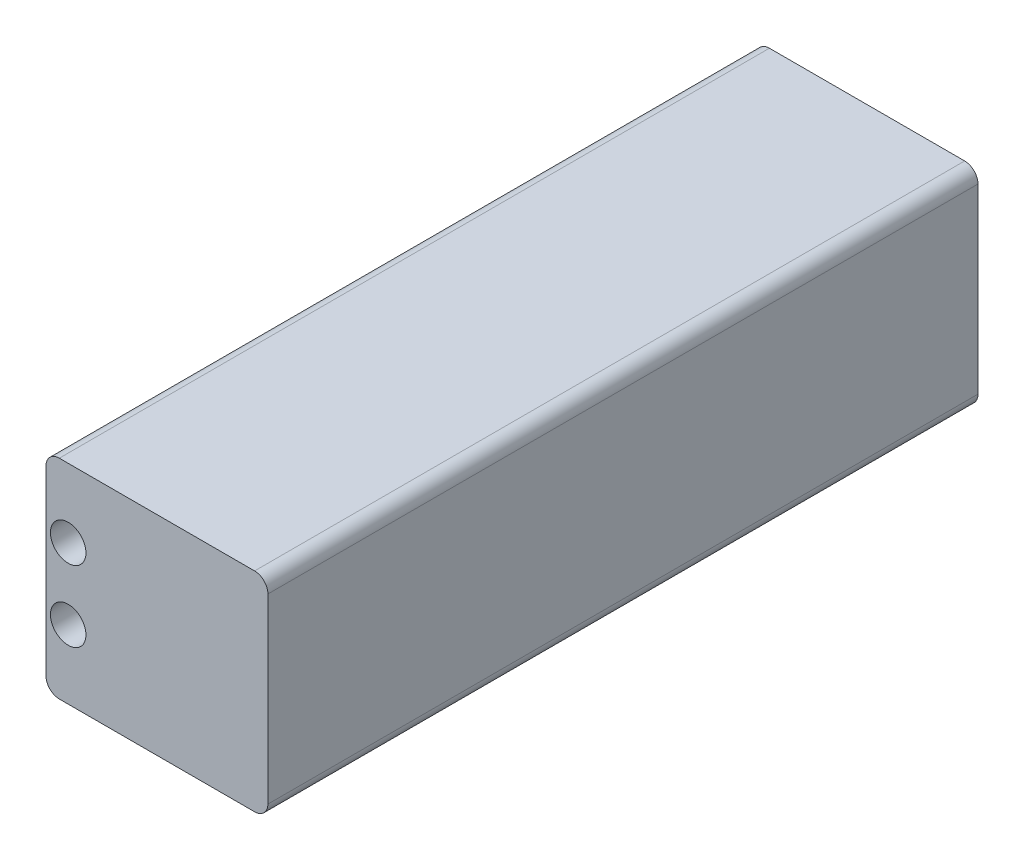
ISO-10303-21;
HEADER;
FILE_DESCRIPTION(('STEP AP214'),'2;1');
FILE_NAME('part.step','',(''),(''),'','','');
FILE_SCHEMA(('AUTOMOTIVE_DESIGN { 1 0 10303 214 1 1 1 1 }'));
ENDSEC;
DATA;
#1=APPLICATION_CONTEXT('core data for automotive mechanical design processes');
#2=APPLICATION_PROTOCOL_DEFINITION('international standard','automotive_design',2000,#1);
#3=PRODUCT_CONTEXT('',#1,'mechanical');
#4=PRODUCT('Part','Part','',(#3));
#5=PRODUCT_RELATED_PRODUCT_CATEGORY('part','',(#4));
#6=PRODUCT_DEFINITION_FORMATION('','',#4);
#7=PRODUCT_DEFINITION_CONTEXT('part definition',#1,'design');
#8=PRODUCT_DEFINITION('design','',#6,#7);
#9=PRODUCT_DEFINITION_SHAPE('','',#8);
#10=(LENGTH_UNIT() NAMED_UNIT(*) SI_UNIT(.MILLI.,.METRE.));
#11=(NAMED_UNIT(*) PLANE_ANGLE_UNIT() SI_UNIT($,.RADIAN.));
#12=(NAMED_UNIT(*) SI_UNIT($,.STERADIAN.) SOLID_ANGLE_UNIT());
#13=UNCERTAINTY_MEASURE_WITH_UNIT(LENGTH_MEASURE(1.E-05),#10,'distance_accuracy_value','');
#14=(GEOMETRIC_REPRESENTATION_CONTEXT(3) GLOBAL_UNCERTAINTY_ASSIGNED_CONTEXT((#13)) GLOBAL_UNIT_ASSIGNED_CONTEXT((#10,
#11,#12)) REPRESENTATION_CONTEXT('',''));
#15=CARTESIAN_POINT('',(0.,0.,0.));
#16=DIRECTION('',(0.,0.,1.));
#17=DIRECTION('',(1.,0.,0.));
#18=AXIS2_PLACEMENT_3D('',#15,#16,#17);
#19=CARTESIAN_POINT('',(25.,47.,80.));
#20=DIRECTION('',(-1.,0.,0.));
#21=DIRECTION('',(0.,0.,1.));
#22=AXIS2_PLACEMENT_3D('',#19,#20,#21);
#23=PLANE('',#22);
#24=DIRECTION('',(0.,-1.,0.));
#25=VECTOR('',#24,1.);
#26=CARTESIAN_POINT('',(25.,47.,80.));
#27=LINE('',#26,#25);
#28=CARTESIAN_POINT('',(25.,44.,80.));
#29=VERTEX_POINT('',#28);
#30=CARTESIAN_POINT('',(25.,3.,80.));
#31=VERTEX_POINT('',#30);
#32=EDGE_CURVE('E127',#29,#31,#27,.T.);
#33=ORIENTED_EDGE('',*,*,#32,.T.);
#34=DIRECTION('',(0.,0.,-1.));
#35=VECTOR('',#34,1.);
#36=CARTESIAN_POINT('',(25.,3.,-80.));
#37=LINE('',#36,#35);
#38=CARTESIAN_POINT('',(25.,3.,-80.));
#39=VERTEX_POINT('',#38);
#40=EDGE_CURVE('E153',#31,#39,#37,.T.);
#41=ORIENTED_EDGE('',*,*,#40,.T.);
#42=DIRECTION('',(0.,-1.,0.));
#43=VECTOR('',#42,1.);
#44=CARTESIAN_POINT('',(25.,47.,-80.));
#45=LINE('',#44,#43);
#46=CARTESIAN_POINT('',(25.,44.,-80.));
#47=VERTEX_POINT('',#46);
#48=EDGE_CURVE('E132',#47,#39,#45,.T.);
#49=ORIENTED_EDGE('',*,*,#48,.F.);
#50=DIRECTION('',(0.,0.,-1.));
#51=VECTOR('',#50,1.);
#52=CARTESIAN_POINT('',(25.,44.,80.));
#53=LINE('',#52,#51);
#54=EDGE_CURVE('E151',#47,#29,#53,.F.);
#55=ORIENTED_EDGE('',*,*,#54,.T.);
#56=EDGE_LOOP('',(#33,#41,#49,#55));
#57=FACE_BOUND('',#56,.T.);
#58=ADVANCED_FACE('F39',(#57),#23,.F.);
#59=CARTESIAN_POINT('',(-25.,47.,-80.));
#60=DIRECTION('',(0.,0.,1.));
#61=DIRECTION('',(1.,0.,0.));
#62=AXIS2_PLACEMENT_3D('',#59,#60,#61);
#63=PLANE('',#62);
#64=DIRECTION('',(-1.,0.,0.));
#65=VECTOR('',#64,1.);
#66=CARTESIAN_POINT('',(-25.,0.,-80.));
#67=LINE('',#66,#65);
#68=CARTESIAN_POINT('',(22.,0.,-80.));
#69=VERTEX_POINT('',#68);
#70=CARTESIAN_POINT('',(-22.,0.,-80.));
#71=VERTEX_POINT('',#70);
#72=EDGE_CURVE('E168',#69,#71,#67,.T.);
#73=ORIENTED_EDGE('',*,*,#72,.T.);
#74=CARTESIAN_POINT('',(-22.,3.,-80.));
#75=DIRECTION('',(0.,0.,1.));
#76=DIRECTION('',(1.,0.,0.));
#77=AXIS2_PLACEMENT_3D('',#74,#75,#76);
#78=CIRCLE('',#77,3.);
#79=CARTESIAN_POINT('',(-25.,3.,-80.));
#80=VERTEX_POINT('',#79);
#81=EDGE_CURVE('E149',#71,#80,#78,.F.);
#82=ORIENTED_EDGE('',*,*,#81,.T.);
#83=DIRECTION('',(0.,-1.,0.));
#84=VECTOR('',#83,1.);
#85=CARTESIAN_POINT('',(-25.,47.,-80.));
#86=LINE('',#85,#84);
#87=CARTESIAN_POINT('',(-25.,44.,-80.));
#88=VERTEX_POINT('',#87);
#89=EDGE_CURVE('E126',#88,#80,#86,.T.);
#90=ORIENTED_EDGE('',*,*,#89,.F.);
#91=CARTESIAN_POINT('',(-22.,44.,-80.));
#92=DIRECTION('',(0.,0.,1.));
#93=DIRECTION('',(1.,0.,0.));
#94=AXIS2_PLACEMENT_3D('',#91,#92,#93);
#95=CIRCLE('',#94,3.);
#96=CARTESIAN_POINT('',(-22.,47.,-80.));
#97=VERTEX_POINT('',#96);
#98=EDGE_CURVE('E131',#88,#97,#95,.F.);
#99=ORIENTED_EDGE('',*,*,#98,.T.);
#100=DIRECTION('',(-1.,0.,0.));
#101=VECTOR('',#100,1.);
#102=CARTESIAN_POINT('',(-25.,47.,-80.));
#103=LINE('',#102,#101);
#104=CARTESIAN_POINT('',(22.,47.,-80.));
#105=VERTEX_POINT('',#104);
#106=EDGE_CURVE('E159',#105,#97,#103,.T.);
#107=ORIENTED_EDGE('',*,*,#106,.F.);
#108=CARTESIAN_POINT('',(22.,44.,-80.));
#109=DIRECTION('',(0.,0.,1.));
#110=DIRECTION('',(1.,0.,0.));
#111=AXIS2_PLACEMENT_3D('',#108,#109,#110);
#112=CIRCLE('',#111,3.);
#113=EDGE_CURVE('E62',#105,#47,#112,.F.);
#114=ORIENTED_EDGE('',*,*,#113,.T.);
#115=ORIENTED_EDGE('',*,*,#48,.T.);
#116=CARTESIAN_POINT('',(22.,3.,-80.));
#117=DIRECTION('',(0.,0.,1.));
#118=DIRECTION('',(1.,0.,0.));
#119=AXIS2_PLACEMENT_3D('',#116,#117,#118);
#120=CIRCLE('',#119,3.);
#121=EDGE_CURVE('E54',#39,#69,#120,.F.);
#122=ORIENTED_EDGE('',*,*,#121,.T.);
#123=EDGE_LOOP('',(#73,#82,#90,#99,#107,#114,#115,#122));
#124=FACE_BOUND('',#123,.T.);
#125=ADVANCED_FACE('F163',(#124),#63,.F.);
#126=CARTESIAN_POINT('',(-25.,47.,80.));
#127=DIRECTION('',(1.,0.,0.));
#128=DIRECTION('',(0.,0.,-1.));
#129=AXIS2_PLACEMENT_3D('',#126,#127,#128);
#130=PLANE('',#129);
#131=ORIENTED_EDGE('',*,*,#89,.T.);
#132=DIRECTION('',(0.,0.,1.));
#133=VECTOR('',#132,1.);
#134=CARTESIAN_POINT('',(-25.,3.,80.));
#135=LINE('',#134,#133);
#136=CARTESIAN_POINT('',(-25.,3.,80.));
#137=VERTEX_POINT('',#136);
#138=EDGE_CURVE('E125',#80,#137,#135,.T.);
#139=ORIENTED_EDGE('',*,*,#138,.T.);
#140=DIRECTION('',(0.,-1.,0.));
#141=VECTOR('',#140,1.);
#142=CARTESIAN_POINT('',(-25.,47.,80.));
#143=LINE('',#142,#141);
#144=CARTESIAN_POINT('',(-25.,44.,80.));
#145=VERTEX_POINT('',#144);
#146=EDGE_CURVE('E109',#145,#137,#143,.T.);
#147=ORIENTED_EDGE('',*,*,#146,.F.);
#148=DIRECTION('',(0.,0.,1.));
#149=VECTOR('',#148,1.);
#150=CARTESIAN_POINT('',(-25.,44.,80.));
#151=LINE('',#150,#149);
#152=EDGE_CURVE('E122',#145,#88,#151,.F.);
#153=ORIENTED_EDGE('',*,*,#152,.T.);
#154=EDGE_LOOP('',(#131,#139,#147,#153));
#155=FACE_BOUND('',#154,.T.);
#156=ADVANCED_FACE('F121',(#155),#130,.F.);
#157=CARTESIAN_POINT('',(-25.,47.,80.));
#158=DIRECTION('',(0.,0.,-1.));
#159=DIRECTION('',(-1.,0.,0.));
#160=AXIS2_PLACEMENT_3D('',#157,#158,#159);
#161=PLANE('',#160);
#162=CARTESIAN_POINT('',(-20.,31.5,80.));
#163=DIRECTION('',(0.,0.,1.));
#164=DIRECTION('',(1.,0.,0.));
#165=AXIS2_PLACEMENT_3D('',#162,#163,#164);
#166=CIRCLE('',#165,4.);
#167=CARTESIAN_POINT('',(-16.,31.5,80.));
#168=VERTEX_POINT('',#167);
#169=EDGE_CURVE('E308',#168,#168,#166,.T.);
#170=ORIENTED_EDGE('',*,*,#169,.F.);
#171=EDGE_LOOP('',(#170));
#172=FACE_BOUND('',#171,.T.);
#173=CARTESIAN_POINT('',(-20.,15.5,80.));
#174=DIRECTION('',(0.,0.,1.));
#175=DIRECTION('',(-1.,0.,0.));
#176=AXIS2_PLACEMENT_3D('',#173,#174,#175);
#177=CIRCLE('',#176,4.);
#178=CARTESIAN_POINT('',(-24.,15.5,80.));
#179=VERTEX_POINT('',#178);
#180=EDGE_CURVE('E311',#179,#179,#177,.T.);
#181=ORIENTED_EDGE('',*,*,#180,.F.);
#182=EDGE_LOOP('',(#181));
#183=FACE_BOUND('',#182,.T.);
#184=ORIENTED_EDGE('',*,*,#146,.T.);
#185=CARTESIAN_POINT('',(-22.,3.,80.));
#186=DIRECTION('',(0.,0.,-1.));
#187=DIRECTION('',(-1.,0.,0.));
#188=AXIS2_PLACEMENT_3D('',#185,#186,#187);
#189=CIRCLE('',#188,3.);
#190=CARTESIAN_POINT('',(-22.,0.,80.));
#191=VERTEX_POINT('',#190);
#192=EDGE_CURVE('E140',#137,#191,#189,.F.);
#193=ORIENTED_EDGE('',*,*,#192,.T.);
#194=DIRECTION('',(1.,0.,0.));
#195=VECTOR('',#194,1.);
#196=CARTESIAN_POINT('',(-25.,0.,80.));
#197=LINE('',#196,#195);
#198=CARTESIAN_POINT('',(22.,0.,80.));
#199=VERTEX_POINT('',#198);
#200=EDGE_CURVE('E164',#191,#199,#197,.T.);
#201=ORIENTED_EDGE('',*,*,#200,.T.);
#202=CARTESIAN_POINT('',(22.,3.,80.));
#203=DIRECTION('',(0.,0.,-1.));
#204=DIRECTION('',(-1.,0.,0.));
#205=AXIS2_PLACEMENT_3D('',#202,#203,#204);
#206=CIRCLE('',#205,3.);
#207=EDGE_CURVE('E115',#199,#31,#206,.F.);
#208=ORIENTED_EDGE('',*,*,#207,.T.);
#209=ORIENTED_EDGE('',*,*,#32,.F.);
#210=CARTESIAN_POINT('',(22.,44.,80.));
#211=DIRECTION('',(0.,0.,-1.));
#212=DIRECTION('',(-1.,0.,0.));
#213=AXIS2_PLACEMENT_3D('',#210,#211,#212);
#214=CIRCLE('',#213,3.);
#215=CARTESIAN_POINT('',(22.,47.,80.));
#216=VERTEX_POINT('',#215);
#217=EDGE_CURVE('E116',#29,#216,#214,.F.);
#218=ORIENTED_EDGE('',*,*,#217,.T.);
#219=DIRECTION('',(1.,0.,0.));
#220=VECTOR('',#219,1.);
#221=CARTESIAN_POINT('',(-25.,47.,80.));
#222=LINE('',#221,#220);
#223=CARTESIAN_POINT('',(-22.,47.,80.));
#224=VERTEX_POINT('',#223);
#225=EDGE_CURVE('E111',#224,#216,#222,.T.);
#226=ORIENTED_EDGE('',*,*,#225,.F.);
#227=CARTESIAN_POINT('',(-22.,44.,80.));
#228=DIRECTION('',(0.,0.,-1.));
#229=DIRECTION('',(-1.,0.,0.));
#230=AXIS2_PLACEMENT_3D('',#227,#228,#229);
#231=CIRCLE('',#230,3.);
#232=EDGE_CURVE('E106',#224,#145,#231,.F.);
#233=ORIENTED_EDGE('',*,*,#232,.T.);
#234=EDGE_LOOP('',(#184,#193,#201,#208,#209,#218,#226,#233));
#235=FACE_BOUND('',#234,.T.);
#236=ADVANCED_FACE('F108',(#172,#183,#235),#161,.F.);
#237=CARTESIAN_POINT('',(0.,47.,0.));
#238=DIRECTION('',(0.,-1.,0.));
#239=DIRECTION('',(0.,0.,-1.));
#240=AXIS2_PLACEMENT_3D('',#237,#238,#239);
#241=PLANE('',#240);
#242=ORIENTED_EDGE('',*,*,#106,.T.);
#243=DIRECTION('',(0.,0.,1.));
#244=VECTOR('',#243,1.);
#245=CARTESIAN_POINT('',(-22.,47.,0.));
#246=LINE('',#245,#244);
#247=EDGE_CURVE('E11',#97,#224,#246,.T.);
#248=ORIENTED_EDGE('',*,*,#247,.T.);
#249=ORIENTED_EDGE('',*,*,#225,.T.);
#250=DIRECTION('',(0.,0.,-1.));
#251=VECTOR('',#250,1.);
#252=CARTESIAN_POINT('',(22.,47.,0.));
#253=LINE('',#252,#251);
#254=EDGE_CURVE('E47',#216,#105,#253,.T.);
#255=ORIENTED_EDGE('',*,*,#254,.T.);
#256=EDGE_LOOP('',(#242,#248,#249,#255));
#257=FACE_BOUND('',#256,.T.);
#258=ADVANCED_FACE('F158',(#257),#241,.F.);
#259=CARTESIAN_POINT('',(0.,0.,0.));
#260=DIRECTION('',(0.,-1.,0.));
#261=DIRECTION('',(0.,0.,-1.));
#262=AXIS2_PLACEMENT_3D('',#259,#260,#261);
#263=PLANE('',#262);
#264=ORIENTED_EDGE('',*,*,#200,.F.);
#265=DIRECTION('',(0.,0.,1.));
#266=VECTOR('',#265,1.);
#267=CARTESIAN_POINT('',(-22.,0.,-80.));
#268=LINE('',#267,#266);
#269=EDGE_CURVE('E144',#191,#71,#268,.F.);
#270=ORIENTED_EDGE('',*,*,#269,.T.);
#271=ORIENTED_EDGE('',*,*,#72,.F.);
#272=DIRECTION('',(0.,0.,-1.));
#273=VECTOR('',#272,1.);
#274=CARTESIAN_POINT('',(22.,0.,80.));
#275=LINE('',#274,#273);
#276=EDGE_CURVE('E142',#69,#199,#275,.F.);
#277=ORIENTED_EDGE('',*,*,#276,.T.);
#278=EDGE_LOOP('',(#264,#270,#271,#277));
#279=FACE_BOUND('',#278,.T.);
#280=ADVANCED_FACE('F184',(#279),#263,.T.);
#281=CARTESIAN_POINT('',(-20.,15.5,70.));
#282=DIRECTION('',(0.,0.,1.));
#283=DIRECTION('',(1.,0.,0.));
#284=AXIS2_PLACEMENT_3D('',#281,#282,#283);
#285=CYLINDRICAL_SURFACE('',#284,4.);
#286=CARTESIAN_POINT('',(-20.,15.5,70.));
#287=DIRECTION('',(0.,0.,1.));
#288=DIRECTION('',(-1.,0.,0.));
#289=AXIS2_PLACEMENT_3D('',#286,#287,#288);
#290=CIRCLE('',#289,4.);
#291=CARTESIAN_POINT('',(-24.,15.5,70.));
#292=VERTEX_POINT('',#291);
#293=EDGE_CURVE('E171',#292,#292,#290,.T.);
#294=ORIENTED_EDGE('',*,*,#293,.F.);
#295=EDGE_LOOP('',(#294));
#296=FACE_BOUND('',#295,.T.);
#297=ORIENTED_EDGE('',*,*,#180,.T.);
#298=EDGE_LOOP('',(#297));
#299=FACE_BOUND('',#298,.T.);
#300=ADVANCED_FACE('F252',(#296,#299),#285,.F.);
#301=CARTESIAN_POINT('',(-20.,15.5,70.));
#302=DIRECTION('',(0.,0.,-1.));
#303=DIRECTION('',(-1.,0.,0.));
#304=AXIS2_PLACEMENT_3D('',#301,#302,#303);
#305=PLANE('',#304);
#306=ORIENTED_EDGE('',*,*,#293,.T.);
#307=EDGE_LOOP('',(#306));
#308=FACE_BOUND('',#307,.T.);
#309=ADVANCED_FACE('F243',(#308),#305,.F.);
#310=CARTESIAN_POINT('',(-20.,31.5,70.));
#311=DIRECTION('',(0.,0.,1.));
#312=DIRECTION('',(1.,0.,0.));
#313=AXIS2_PLACEMENT_3D('',#310,#311,#312);
#314=CYLINDRICAL_SURFACE('',#313,4.);
#315=CARTESIAN_POINT('',(-20.,31.5,70.));
#316=DIRECTION('',(0.,0.,1.));
#317=DIRECTION('',(1.,0.,0.));
#318=AXIS2_PLACEMENT_3D('',#315,#316,#317);
#319=CIRCLE('',#318,4.);
#320=CARTESIAN_POINT('',(-16.,31.5,70.));
#321=VERTEX_POINT('',#320);
#322=EDGE_CURVE('E174',#321,#321,#319,.T.);
#323=ORIENTED_EDGE('',*,*,#322,.F.);
#324=EDGE_LOOP('',(#323));
#325=FACE_BOUND('',#324,.T.);
#326=ORIENTED_EDGE('',*,*,#169,.T.);
#327=EDGE_LOOP('',(#326));
#328=FACE_BOUND('',#327,.T.);
#329=ADVANCED_FACE('F234',(#325,#328),#314,.F.);
#330=CARTESIAN_POINT('',(-20.,31.5,70.));
#331=DIRECTION('',(0.,0.,1.));
#332=DIRECTION('',(1.,0.,0.));
#333=AXIS2_PLACEMENT_3D('',#330,#331,#332);
#334=PLANE('',#333);
#335=ORIENTED_EDGE('',*,*,#322,.T.);
#336=EDGE_LOOP('',(#335));
#337=FACE_BOUND('',#336,.T.);
#338=ADVANCED_FACE('F205',(#337),#334,.T.);
#339=CARTESIAN_POINT('',(-22.,3.,80.));
#340=DIRECTION('',(0.,0.,-1.));
#341=DIRECTION('',(-1.,0.,0.));
#342=AXIS2_PLACEMENT_3D('',#339,#340,#341);
#343=CYLINDRICAL_SURFACE('',#342,3.);
#344=ORIENTED_EDGE('',*,*,#81,.F.);
#345=ORIENTED_EDGE('',*,*,#269,.F.);
#346=ORIENTED_EDGE('',*,*,#192,.F.);
#347=ORIENTED_EDGE('',*,*,#138,.F.);
#348=EDGE_LOOP('',(#344,#345,#346,#347));
#349=FACE_BOUND('',#348,.T.);
#350=ADVANCED_FACE('F179',(#349),#343,.T.);
#351=CARTESIAN_POINT('',(22.,3.,80.));
#352=DIRECTION('',(0.,0.,1.));
#353=DIRECTION('',(1.,0.,0.));
#354=AXIS2_PLACEMENT_3D('',#351,#352,#353);
#355=CYLINDRICAL_SURFACE('',#354,3.);
#356=ORIENTED_EDGE('',*,*,#207,.F.);
#357=ORIENTED_EDGE('',*,*,#276,.F.);
#358=ORIENTED_EDGE('',*,*,#121,.F.);
#359=ORIENTED_EDGE('',*,*,#40,.F.);
#360=EDGE_LOOP('',(#356,#357,#358,#359));
#361=FACE_BOUND('',#360,.T.);
#362=ADVANCED_FACE('F186',(#361),#355,.T.);
#363=CARTESIAN_POINT('',(-22.,44.,0.));
#364=DIRECTION('',(0.,0.,1.));
#365=DIRECTION('',(1.,0.,0.));
#366=AXIS2_PLACEMENT_3D('',#363,#364,#365);
#367=CYLINDRICAL_SURFACE('',#366,3.);
#368=ORIENTED_EDGE('',*,*,#98,.F.);
#369=ORIENTED_EDGE('',*,*,#152,.F.);
#370=ORIENTED_EDGE('',*,*,#232,.F.);
#371=ORIENTED_EDGE('',*,*,#247,.F.);
#372=EDGE_LOOP('',(#368,#369,#370,#371));
#373=FACE_BOUND('',#372,.T.);
#374=ADVANCED_FACE('F130',(#373),#367,.T.);
#375=CARTESIAN_POINT('',(22.,44.,0.));
#376=DIRECTION('',(0.,0.,-1.));
#377=DIRECTION('',(-1.,0.,0.));
#378=AXIS2_PLACEMENT_3D('',#375,#376,#377);
#379=CYLINDRICAL_SURFACE('',#378,3.);
#380=ORIENTED_EDGE('',*,*,#217,.F.);
#381=ORIENTED_EDGE('',*,*,#54,.F.);
#382=ORIENTED_EDGE('',*,*,#113,.F.);
#383=ORIENTED_EDGE('',*,*,#254,.F.);
#384=EDGE_LOOP('',(#380,#381,#382,#383));
#385=FACE_BOUND('',#384,.T.);
#386=ADVANCED_FACE('F41',(#385),#379,.T.);
#387=CLOSED_SHELL('',(#58,#125,#156,#236,#258,#280,#300,#309,#329,#338,#350,#362,#374,#386));
#388=MANIFOLD_SOLID_BREP('B2',#387);
#389=ADVANCED_BREP_SHAPE_REPRESENTATION('',(#18,#388),#14);
#390=SHAPE_DEFINITION_REPRESENTATION(#9,#389);
ENDSEC;
END-ISO-10303-21;
